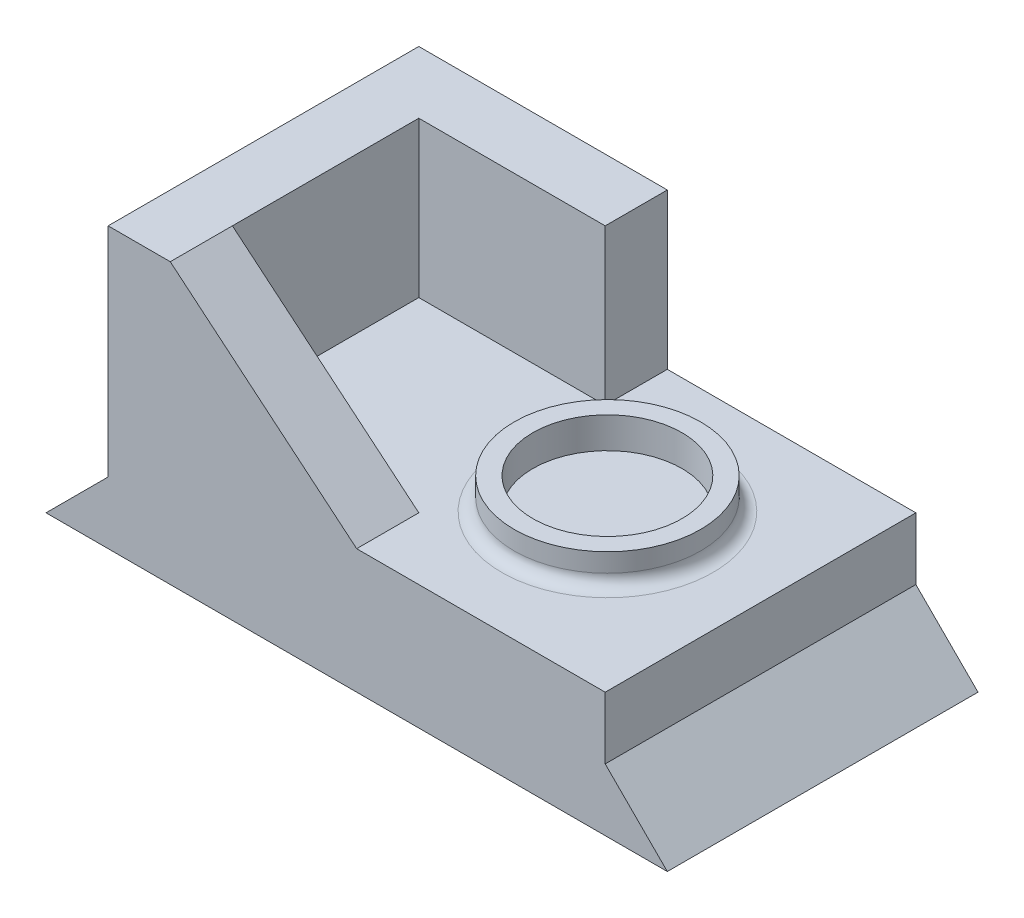
ISO-10303-21;
HEADER;
FILE_DESCRIPTION(('STEP AP214'),'2;1');
FILE_NAME('part.step','',(''),(''),'','','');
FILE_SCHEMA(('AUTOMOTIVE_DESIGN { 1 0 10303 214 1 1 1 1 }'));
ENDSEC;
DATA;
#1=APPLICATION_CONTEXT('core data for automotive mechanical design processes');
#2=APPLICATION_PROTOCOL_DEFINITION('international standard','automotive_design',2000,#1);
#3=PRODUCT_CONTEXT('',#1,'mechanical');
#4=PRODUCT('Part','Part','',(#3));
#5=PRODUCT_RELATED_PRODUCT_CATEGORY('part','',(#4));
#6=PRODUCT_DEFINITION_FORMATION('','',#4);
#7=PRODUCT_DEFINITION_CONTEXT('part definition',#1,'design');
#8=PRODUCT_DEFINITION('design','',#6,#7);
#9=PRODUCT_DEFINITION_SHAPE('','',#8);
#10=(LENGTH_UNIT() NAMED_UNIT(*) SI_UNIT(.MILLI.,.METRE.));
#11=(NAMED_UNIT(*) PLANE_ANGLE_UNIT() SI_UNIT($,.RADIAN.));
#12=(NAMED_UNIT(*) SI_UNIT($,.STERADIAN.) SOLID_ANGLE_UNIT());
#13=UNCERTAINTY_MEASURE_WITH_UNIT(LENGTH_MEASURE(1.E-05),#10,'distance_accuracy_value','');
#14=(GEOMETRIC_REPRESENTATION_CONTEXT(3) GLOBAL_UNCERTAINTY_ASSIGNED_CONTEXT((#13)) GLOBAL_UNIT_ASSIGNED_CONTEXT((#10,
#11,#12)) REPRESENTATION_CONTEXT('',''));
#15=CARTESIAN_POINT('',(0.,0.,0.));
#16=DIRECTION('',(0.,0.,1.));
#17=DIRECTION('',(1.,0.,0.));
#18=AXIS2_PLACEMENT_3D('',#15,#16,#17);
#19=CARTESIAN_POINT('',(50.,45.,-50.));
#20=DIRECTION('',(0.,1.,0.));
#21=DIRECTION('',(-1.,0.,0.));
#22=AXIS2_PLACEMENT_3D('',#19,#20,#21);
#23=PLANE('',#22);
#24=DIRECTION('',(-1.,0.,0.));
#25=VECTOR('',#24,1.);
#26=CARTESIAN_POINT('',(50.,45.,0.));
#27=LINE('',#26,#25);
#28=CARTESIAN_POINT('',(20.,45.,0.));
#29=VERTEX_POINT('',#28);
#30=CARTESIAN_POINT('',(10.,45.,0.));
#31=VERTEX_POINT('',#30);
#32=EDGE_CURVE('E139',#29,#31,#27,.T.);
#33=ORIENTED_EDGE('',*,*,#32,.F.);
#34=DIRECTION('',(0.,0.,1.));
#35=VECTOR('',#34,1.);
#36=CARTESIAN_POINT('',(20.,45.,-10.));
#37=LINE('',#36,#35);
#38=CARTESIAN_POINT('',(20.,45.,-10.));
#39=VERTEX_POINT('',#38);
#40=EDGE_CURVE('E125',#39,#29,#37,.T.);
#41=ORIENTED_EDGE('',*,*,#40,.F.);
#42=DIRECTION('',(0.,0.,1.));
#43=VECTOR('',#42,1.);
#44=CARTESIAN_POINT('',(20.,45.,-40.));
#45=LINE('',#44,#43);
#46=CARTESIAN_POINT('',(20.,45.,-40.));
#47=VERTEX_POINT('',#46);
#48=EDGE_CURVE('E137',#47,#39,#45,.T.);
#49=ORIENTED_EDGE('',*,*,#48,.F.);
#50=DIRECTION('',(1.,0.,0.));
#51=VECTOR('',#50,1.);
#52=CARTESIAN_POINT('',(20.,45.,-40.));
#53=LINE('',#52,#51);
#54=CARTESIAN_POINT('',(50.,45.,-40.));
#55=VERTEX_POINT('',#54);
#56=EDGE_CURVE('E161',#47,#55,#53,.T.);
#57=ORIENTED_EDGE('',*,*,#56,.T.);
#58=DIRECTION('',(0.,0.,1.));
#59=VECTOR('',#58,1.);
#60=CARTESIAN_POINT('',(50.,45.,-50.));
#61=LINE('',#60,#59);
#62=CARTESIAN_POINT('',(50.,45.,-50.));
#63=VERTEX_POINT('',#62);
#64=EDGE_CURVE('E214',#63,#55,#61,.T.);
#65=ORIENTED_EDGE('',*,*,#64,.F.);
#66=DIRECTION('',(-1.,0.,0.));
#67=VECTOR('',#66,1.);
#68=CARTESIAN_POINT('',(50.,45.,-50.));
#69=LINE('',#68,#67);
#70=CARTESIAN_POINT('',(10.,45.,-50.));
#71=VERTEX_POINT('',#70);
#72=EDGE_CURVE('E204',#63,#71,#69,.T.);
#73=ORIENTED_EDGE('',*,*,#72,.T.);
#74=DIRECTION('',(0.,0.,1.));
#75=VECTOR('',#74,1.);
#76=CARTESIAN_POINT('',(10.,45.,-50.));
#77=LINE('',#76,#75);
#78=EDGE_CURVE('E192',#71,#31,#77,.T.);
#79=ORIENTED_EDGE('',*,*,#78,.T.);
#80=EDGE_LOOP('',(#33,#41,#49,#57,#65,#73,#79));
#81=FACE_BOUND('',#80,.T.);
#82=ADVANCED_FACE('F38',(#81),#23,.T.);
#83=CARTESIAN_POINT('',(0.,0.,0.));
#84=DIRECTION('',(0.,0.,1.));
#85=DIRECTION('',(1.,0.,0.));
#86=AXIS2_PLACEMENT_3D('',#83,#84,#85);
#87=PLANE('',#86);
#88=DIRECTION('',(-1.,0.,0.));
#89=VECTOR('',#88,1.);
#90=CARTESIAN_POINT('',(100.,20.,0.));
#91=LINE('',#90,#89);
#92=CARTESIAN_POINT('',(90.,20.,0.));
#93=VERTEX_POINT('',#92);
#94=CARTESIAN_POINT('',(50.,20.,0.));
#95=VERTEX_POINT('',#94);
#96=EDGE_CURVE('E210',#93,#95,#91,.T.);
#97=ORIENTED_EDGE('',*,*,#96,.T.);
#98=DIRECTION('',(-0.768221279597376,0.64018439966448,0.));
#99=VECTOR('',#98,1.);
#100=CARTESIAN_POINT('',(50.,20.,0.));
#101=LINE('',#100,#99);
#102=EDGE_CURVE('E130',#95,#29,#101,.T.);
#103=ORIENTED_EDGE('',*,*,#102,.T.);
#104=ORIENTED_EDGE('',*,*,#32,.T.);
#105=DIRECTION('',(0.,1.,0.));
#106=VECTOR('',#105,1.);
#107=CARTESIAN_POINT('',(10.,45.,0.));
#108=LINE('',#107,#106);
#109=CARTESIAN_POINT('',(10.,10.,0.));
#110=VERTEX_POINT('',#109);
#111=EDGE_CURVE('E184',#110,#31,#108,.T.);
#112=ORIENTED_EDGE('',*,*,#111,.F.);
#113=DIRECTION('',(0.707106781186548,0.707106781186548,0.));
#114=VECTOR('',#113,1.);
#115=CARTESIAN_POINT('',(10.,10.,0.));
#116=LINE('',#115,#114);
#117=CARTESIAN_POINT('',(0.,0.,0.));
#118=VERTEX_POINT('',#117);
#119=EDGE_CURVE('E178',#118,#110,#116,.T.);
#120=ORIENTED_EDGE('',*,*,#119,.F.);
#121=DIRECTION('',(1.,0.,0.));
#122=VECTOR('',#121,1.);
#123=CARTESIAN_POINT('',(0.,0.,0.));
#124=LINE('',#123,#122);
#125=CARTESIAN_POINT('',(100.,0.,0.));
#126=VERTEX_POINT('',#125);
#127=EDGE_CURVE('E194',#118,#126,#124,.T.);
#128=ORIENTED_EDGE('',*,*,#127,.T.);
#129=DIRECTION('',(0.707106781186547,-0.707106781186548,0.));
#130=VECTOR('',#129,1.);
#131=CARTESIAN_POINT('',(90.,10.,0.));
#132=LINE('',#131,#130);
#133=CARTESIAN_POINT('',(90.,10.,0.));
#134=VERTEX_POINT('',#133);
#135=EDGE_CURVE('E171',#134,#126,#132,.T.);
#136=ORIENTED_EDGE('',*,*,#135,.F.);
#137=DIRECTION('',(0.,-1.,0.));
#138=VECTOR('',#137,1.);
#139=CARTESIAN_POINT('',(90.,20.,0.));
#140=LINE('',#139,#138);
#141=EDGE_CURVE('E163',#93,#134,#140,.T.);
#142=ORIENTED_EDGE('',*,*,#141,.F.);
#143=EDGE_LOOP('',(#97,#103,#104,#112,#120,#128,#136,#142));
#144=FACE_BOUND('',#143,.T.);
#145=ADVANCED_FACE('F244',(#144),#87,.T.);
#146=CARTESIAN_POINT('',(20.,45.,-10.));
#147=DIRECTION('',(0.,0.,1.));
#148=DIRECTION('',(0.,-1.,0.));
#149=AXIS2_PLACEMENT_3D('',#146,#147,#148);
#150=PLANE('',#149);
#151=DIRECTION('',(-0.768221279597376,0.64018439966448,0.));
#152=VECTOR('',#151,1.);
#153=CARTESIAN_POINT('',(50.,20.,-10.));
#154=LINE('',#153,#152);
#155=CARTESIAN_POINT('',(50.,20.,-10.));
#156=VERTEX_POINT('',#155);
#157=EDGE_CURVE('E122',#156,#39,#154,.T.);
#158=ORIENTED_EDGE('',*,*,#157,.F.);
#159=DIRECTION('',(1.,0.,0.));
#160=VECTOR('',#159,1.);
#161=CARTESIAN_POINT('',(20.,20.,-10.));
#162=LINE('',#161,#160);
#163=CARTESIAN_POINT('',(20.,20.,-10.));
#164=VERTEX_POINT('',#163);
#165=EDGE_CURVE('E145',#164,#156,#162,.T.);
#166=ORIENTED_EDGE('',*,*,#165,.F.);
#167=DIRECTION('',(0.,-1.,0.));
#168=VECTOR('',#167,1.);
#169=CARTESIAN_POINT('',(20.,45.,-10.));
#170=LINE('',#169,#168);
#171=EDGE_CURVE('E143',#39,#164,#170,.T.);
#172=ORIENTED_EDGE('',*,*,#171,.F.);
#173=EDGE_LOOP('',(#158,#166,#172));
#174=FACE_BOUND('',#173,.T.);
#175=ADVANCED_FACE('F144',(#174),#150,.F.);
#176=CARTESIAN_POINT('',(50.,20.,-50.));
#177=DIRECTION('',(1.,0.,0.));
#178=DIRECTION('',(0.,0.,-1.));
#179=AXIS2_PLACEMENT_3D('',#176,#177,#178);
#180=PLANE('',#179);
#181=DIRECTION('',(0.,1.,0.));
#182=VECTOR('',#181,1.);
#183=CARTESIAN_POINT('',(50.,20.,-40.));
#184=LINE('',#183,#182);
#185=CARTESIAN_POINT('',(50.,20.,-40.));
#186=VERTEX_POINT('',#185);
#187=EDGE_CURVE('E140',#186,#55,#184,.T.);
#188=ORIENTED_EDGE('',*,*,#187,.F.);
#189=DIRECTION('',(0.,0.,1.));
#190=VECTOR('',#189,1.);
#191=CARTESIAN_POINT('',(50.,20.,-50.));
#192=LINE('',#191,#190);
#193=CARTESIAN_POINT('',(50.,20.,-50.));
#194=VERTEX_POINT('',#193);
#195=EDGE_CURVE('E218',#194,#186,#192,.T.);
#196=ORIENTED_EDGE('',*,*,#195,.F.);
#197=DIRECTION('',(0.,1.,0.));
#198=VECTOR('',#197,1.);
#199=CARTESIAN_POINT('',(50.,20.,-50.));
#200=LINE('',#199,#198);
#201=EDGE_CURVE('E201',#194,#63,#200,.T.);
#202=ORIENTED_EDGE('',*,*,#201,.T.);
#203=ORIENTED_EDGE('',*,*,#64,.T.);
#204=EDGE_LOOP('',(#188,#196,#202,#203));
#205=FACE_BOUND('',#204,.T.);
#206=ADVANCED_FACE('F253',(#205),#180,.T.);
#207=CARTESIAN_POINT('',(100.,20.,-50.));
#208=DIRECTION('',(0.,1.,0.));
#209=DIRECTION('',(-1.,0.,0.));
#210=AXIS2_PLACEMENT_3D('',#207,#208,#209);
#211=PLANE('',#210);
#212=CARTESIAN_POINT('',(65.,20.,-25.3570674190145));
#213=DIRECTION('',(0.,1.,0.));
#214=DIRECTION('',(-1.,0.,0.));
#215=AXIS2_PLACEMENT_3D('',#212,#213,#214);
#216=CIRCLE('',#215,17.);
#217=CARTESIAN_POINT('',(48.,20.,-25.3570674190145));
#218=VERTEX_POINT('',#217);
#219=EDGE_CURVE('E11',#218,#218,#216,.F.);
#220=ORIENTED_EDGE('',*,*,#219,.T.);
#221=EDGE_LOOP('',(#220));
#222=FACE_BOUND('',#221,.T.);
#223=DIRECTION('',(0.,0.,1.));
#224=VECTOR('',#223,1.);
#225=CARTESIAN_POINT('',(90.,20.,-50.));
#226=LINE('',#225,#224);
#227=CARTESIAN_POINT('',(90.,20.,-50.));
#228=VERTEX_POINT('',#227);
#229=EDGE_CURVE('E61',#228,#93,#226,.T.);
#230=ORIENTED_EDGE('',*,*,#229,.F.);
#231=DIRECTION('',(-1.,0.,0.));
#232=VECTOR('',#231,1.);
#233=CARTESIAN_POINT('',(100.,20.,-50.));
#234=LINE('',#233,#232);
#235=EDGE_CURVE('E199',#228,#194,#234,.T.);
#236=ORIENTED_EDGE('',*,*,#235,.T.);
#237=ORIENTED_EDGE('',*,*,#195,.T.);
#238=DIRECTION('',(1.,0.,0.));
#239=VECTOR('',#238,1.);
#240=CARTESIAN_POINT('',(20.,20.,-40.));
#241=LINE('',#240,#239);
#242=CARTESIAN_POINT('',(20.,20.,-40.));
#243=VERTEX_POINT('',#242);
#244=EDGE_CURVE('E164',#243,#186,#241,.T.);
#245=ORIENTED_EDGE('',*,*,#244,.F.);
#246=DIRECTION('',(0.,0.,-1.));
#247=VECTOR('',#246,1.);
#248=CARTESIAN_POINT('',(20.,20.,-10.));
#249=LINE('',#248,#247);
#250=EDGE_CURVE('E149',#164,#243,#249,.T.);
#251=ORIENTED_EDGE('',*,*,#250,.F.);
#252=ORIENTED_EDGE('',*,*,#165,.T.);
#253=EDGE_CURVE('E53',#156,#95,#192,.T.);
#254=ORIENTED_EDGE('',*,*,#253,.T.);
#255=ORIENTED_EDGE('',*,*,#96,.F.);
#256=EDGE_LOOP('',(#230,#236,#237,#245,#251,#252,#254,#255));
#257=FACE_BOUND('',#256,.T.);
#258=ADVANCED_FACE('F241',(#222,#257),#211,.T.);
#259=CARTESIAN_POINT('',(0.,0.,-50.));
#260=DIRECTION('',(0.,-1.,0.));
#261=DIRECTION('',(0.,0.,-1.));
#262=AXIS2_PLACEMENT_3D('',#259,#260,#261);
#263=PLANE('',#262);
#264=ORIENTED_EDGE('',*,*,#127,.F.);
#265=DIRECTION('',(0.,0.,1.));
#266=VECTOR('',#265,1.);
#267=CARTESIAN_POINT('',(0.,0.,-50.));
#268=LINE('',#267,#266);
#269=CARTESIAN_POINT('',(0.,0.,-50.));
#270=VERTEX_POINT('',#269);
#271=EDGE_CURVE('E207',#270,#118,#268,.T.);
#272=ORIENTED_EDGE('',*,*,#271,.F.);
#273=DIRECTION('',(1.,0.,0.));
#274=VECTOR('',#273,1.);
#275=CARTESIAN_POINT('',(0.,0.,-50.));
#276=LINE('',#275,#274);
#277=CARTESIAN_POINT('',(100.,0.,-50.));
#278=VERTEX_POINT('',#277);
#279=EDGE_CURVE('E196',#270,#278,#276,.T.);
#280=ORIENTED_EDGE('',*,*,#279,.T.);
#281=DIRECTION('',(0.,0.,1.));
#282=VECTOR('',#281,1.);
#283=CARTESIAN_POINT('',(100.,0.,-50.));
#284=LINE('',#283,#282);
#285=EDGE_CURVE('E221',#278,#126,#284,.T.);
#286=ORIENTED_EDGE('',*,*,#285,.T.);
#287=EDGE_LOOP('',(#264,#272,#280,#286));
#288=FACE_BOUND('',#287,.T.);
#289=ADVANCED_FACE('F257',(#288),#263,.T.);
#290=CARTESIAN_POINT('',(0.,0.,-50.));
#291=DIRECTION('',(0.,0.,1.));
#292=DIRECTION('',(1.,0.,0.));
#293=AXIS2_PLACEMENT_3D('',#290,#291,#292);
#294=PLANE('',#293);
#295=DIRECTION('',(0.,-1.,0.));
#296=VECTOR('',#295,1.);
#297=CARTESIAN_POINT('',(90.,20.,-50.));
#298=LINE('',#297,#296);
#299=CARTESIAN_POINT('',(90.,10.,-50.));
#300=VERTEX_POINT('',#299);
#301=EDGE_CURVE('E167',#228,#300,#298,.T.);
#302=ORIENTED_EDGE('',*,*,#301,.T.);
#303=DIRECTION('',(0.707106781186547,-0.707106781186548,0.));
#304=VECTOR('',#303,1.);
#305=CARTESIAN_POINT('',(90.,10.,-50.));
#306=LINE('',#305,#304);
#307=EDGE_CURVE('E170',#300,#278,#306,.T.);
#308=ORIENTED_EDGE('',*,*,#307,.T.);
#309=ORIENTED_EDGE('',*,*,#279,.F.);
#310=DIRECTION('',(0.707106781186548,0.707106781186548,0.));
#311=VECTOR('',#310,1.);
#312=CARTESIAN_POINT('',(10.,10.,-50.));
#313=LINE('',#312,#311);
#314=CARTESIAN_POINT('',(10.,10.,-50.));
#315=VERTEX_POINT('',#314);
#316=EDGE_CURVE('E180',#270,#315,#313,.T.);
#317=ORIENTED_EDGE('',*,*,#316,.T.);
#318=DIRECTION('',(0.,1.,0.));
#319=VECTOR('',#318,1.);
#320=CARTESIAN_POINT('',(10.,45.,-50.));
#321=LINE('',#320,#319);
#322=EDGE_CURVE('E183',#315,#71,#321,.T.);
#323=ORIENTED_EDGE('',*,*,#322,.T.);
#324=ORIENTED_EDGE('',*,*,#72,.F.);
#325=ORIENTED_EDGE('',*,*,#201,.F.);
#326=ORIENTED_EDGE('',*,*,#235,.F.);
#327=EDGE_LOOP('',(#302,#308,#309,#317,#323,#324,#325,#326));
#328=FACE_BOUND('',#327,.T.);
#329=ADVANCED_FACE('F260',(#328),#294,.F.);
#330=CARTESIAN_POINT('',(10.,45.,-50.));
#331=DIRECTION('',(1.,0.,0.));
#332=DIRECTION('',(0.,1.,0.));
#333=AXIS2_PLACEMENT_3D('',#330,#331,#332);
#334=PLANE('',#333);
#335=ORIENTED_EDGE('',*,*,#111,.T.);
#336=ORIENTED_EDGE('',*,*,#78,.F.);
#337=ORIENTED_EDGE('',*,*,#322,.F.);
#338=DIRECTION('',(0.,0.,1.));
#339=VECTOR('',#338,1.);
#340=CARTESIAN_POINT('',(10.,10.,-50.));
#341=LINE('',#340,#339);
#342=EDGE_CURVE('E187',#315,#110,#341,.T.);
#343=ORIENTED_EDGE('',*,*,#342,.T.);
#344=EDGE_LOOP('',(#335,#336,#337,#343));
#345=FACE_BOUND('',#344,.T.);
#346=ADVANCED_FACE('F265',(#345),#334,.F.);
#347=CARTESIAN_POINT('',(10.,10.,-50.));
#348=DIRECTION('',(0.707106781186548,-0.707106781186548,0.));
#349=DIRECTION('',(0.707106781186548,0.707106781186548,0.));
#350=AXIS2_PLACEMENT_3D('',#347,#348,#349);
#351=PLANE('',#350);
#352=ORIENTED_EDGE('',*,*,#119,.T.);
#353=ORIENTED_EDGE('',*,*,#342,.F.);
#354=ORIENTED_EDGE('',*,*,#316,.F.);
#355=ORIENTED_EDGE('',*,*,#271,.T.);
#356=EDGE_LOOP('',(#352,#353,#354,#355));
#357=FACE_BOUND('',#356,.T.);
#358=ADVANCED_FACE('F274',(#357),#351,.F.);
#359=CARTESIAN_POINT('',(90.,10.,-50.));
#360=DIRECTION('',(-0.707106781186548,-0.707106781186547,0.));
#361=DIRECTION('',(0.707106781186547,-0.707106781186548,0.));
#362=AXIS2_PLACEMENT_3D('',#359,#360,#361);
#363=PLANE('',#362);
#364=ORIENTED_EDGE('',*,*,#135,.T.);
#365=ORIENTED_EDGE('',*,*,#285,.F.);
#366=ORIENTED_EDGE('',*,*,#307,.F.);
#367=DIRECTION('',(0.,0.,1.));
#368=VECTOR('',#367,1.);
#369=CARTESIAN_POINT('',(90.,10.,-50.));
#370=LINE('',#369,#368);
#371=EDGE_CURVE('E176',#300,#134,#370,.T.);
#372=ORIENTED_EDGE('',*,*,#371,.T.);
#373=EDGE_LOOP('',(#364,#365,#366,#372));
#374=FACE_BOUND('',#373,.T.);
#375=ADVANCED_FACE('F280',(#374),#363,.F.);
#376=CARTESIAN_POINT('',(90.,20.,-50.));
#377=DIRECTION('',(-1.,0.,0.));
#378=DIRECTION('',(0.,0.,1.));
#379=AXIS2_PLACEMENT_3D('',#376,#377,#378);
#380=PLANE('',#379);
#381=ORIENTED_EDGE('',*,*,#141,.T.);
#382=ORIENTED_EDGE('',*,*,#371,.F.);
#383=ORIENTED_EDGE('',*,*,#301,.F.);
#384=ORIENTED_EDGE('',*,*,#229,.T.);
#385=EDGE_LOOP('',(#381,#382,#383,#384));
#386=FACE_BOUND('',#385,.T.);
#387=ADVANCED_FACE('F281',(#386),#380,.F.);
#388=CARTESIAN_POINT('',(20.,20.,-40.));
#389=DIRECTION('',(0.,0.,-1.));
#390=DIRECTION('',(-1.,0.,0.));
#391=AXIS2_PLACEMENT_3D('',#388,#389,#390);
#392=PLANE('',#391);
#393=ORIENTED_EDGE('',*,*,#187,.T.);
#394=ORIENTED_EDGE('',*,*,#56,.F.);
#395=DIRECTION('',(0.,1.,0.));
#396=VECTOR('',#395,1.);
#397=CARTESIAN_POINT('',(20.,20.,-40.));
#398=LINE('',#397,#396);
#399=EDGE_CURVE('E154',#243,#47,#398,.T.);
#400=ORIENTED_EDGE('',*,*,#399,.F.);
#401=ORIENTED_EDGE('',*,*,#244,.T.);
#402=EDGE_LOOP('',(#393,#394,#400,#401));
#403=FACE_BOUND('',#402,.T.);
#404=ADVANCED_FACE('F285',(#403),#392,.F.);
#405=CARTESIAN_POINT('',(20.,0.,0.));
#406=DIRECTION('',(1.,0.,0.));
#407=DIRECTION('',(0.,0.,-1.));
#408=AXIS2_PLACEMENT_3D('',#405,#406,#407);
#409=PLANE('',#408);
#410=ORIENTED_EDGE('',*,*,#48,.T.);
#411=ORIENTED_EDGE('',*,*,#171,.T.);
#412=ORIENTED_EDGE('',*,*,#250,.T.);
#413=ORIENTED_EDGE('',*,*,#399,.T.);
#414=EDGE_LOOP('',(#410,#411,#412,#413));
#415=FACE_BOUND('',#414,.T.);
#416=ADVANCED_FACE('F152',(#415),#409,.T.);
#417=CARTESIAN_POINT('',(50.,20.,-10.));
#418=DIRECTION('',(0.64018439966448,0.768221279597376,0.));
#419=DIRECTION('',(-0.768221279597376,0.64018439966448,0.));
#420=AXIS2_PLACEMENT_3D('',#417,#418,#419);
#421=PLANE('',#420);
#422=ORIENTED_EDGE('',*,*,#102,.F.);
#423=ORIENTED_EDGE('',*,*,#253,.F.);
#424=ORIENTED_EDGE('',*,*,#157,.T.);
#425=ORIENTED_EDGE('',*,*,#40,.T.);
#426=EDGE_LOOP('',(#422,#423,#424,#425));
#427=FACE_BOUND('',#426,.T.);
#428=ADVANCED_FACE('F124',(#427),#421,.T.);
#429=CARTESIAN_POINT('',(65.,25.,-25.3570674190145));
#430=DIRECTION('',(0.,1.,0.));
#431=DIRECTION('',(-1.,0.,0.));
#432=AXIS2_PLACEMENT_3D('',#429,#430,#431);
#433=PLANE('',#432);
#434=CARTESIAN_POINT('',(65.,25.,-25.3570674190145));
#435=DIRECTION('',(0.,1.,0.));
#436=DIRECTION('',(-1.,0.,0.));
#437=AXIS2_PLACEMENT_3D('',#434,#435,#436);
#438=CIRCLE('',#437,15.);
#439=CARTESIAN_POINT('',(50.,25.,-25.3570674190145));
#440=VERTEX_POINT('',#439);
#441=EDGE_CURVE('E325',#440,#440,#438,.T.);
#442=ORIENTED_EDGE('',*,*,#441,.T.);
#443=EDGE_LOOP('',(#442));
#444=FACE_BOUND('',#443,.T.);
#445=CARTESIAN_POINT('',(65.,25.,-25.3570674190145));
#446=DIRECTION('',(0.,1.,0.));
#447=DIRECTION('',(-1.,0.,0.));
#448=AXIS2_PLACEMENT_3D('',#445,#446,#447);
#449=CIRCLE('',#448,12.);
#450=CARTESIAN_POINT('',(53.,25.,-25.3570674190145));
#451=VERTEX_POINT('',#450);
#452=EDGE_CURVE('E322',#451,#451,#449,.T.);
#453=ORIENTED_EDGE('',*,*,#452,.F.);
#454=EDGE_LOOP('',(#453));
#455=FACE_BOUND('',#454,.T.);
#456=ADVANCED_FACE('F309',(#444,#455),#433,.T.);
#457=CARTESIAN_POINT('',(65.,25.,-25.3570674190145));
#458=DIRECTION('',(0.,-1.,0.));
#459=DIRECTION('',(1.,0.,0.));
#460=AXIS2_PLACEMENT_3D('',#457,#458,#459);
#461=CYLINDRICAL_SURFACE('',#460,15.);
#462=CARTESIAN_POINT('',(65.,22.,-25.3570674190145));
#463=DIRECTION('',(0.,1.,0.));
#464=DIRECTION('',(-1.,0.,0.));
#465=AXIS2_PLACEMENT_3D('',#462,#463,#464);
#466=CIRCLE('',#465,15.);
#467=CARTESIAN_POINT('',(50.,22.,-25.3570674190145));
#468=VERTEX_POINT('',#467);
#469=EDGE_CURVE('E46',#468,#468,#466,.T.);
#470=ORIENTED_EDGE('',*,*,#469,.T.);
#471=EDGE_LOOP('',(#470));
#472=FACE_BOUND('',#471,.T.);
#473=ORIENTED_EDGE('',*,*,#441,.F.);
#474=EDGE_LOOP('',(#473));
#475=FACE_BOUND('',#474,.T.);
#476=ADVANCED_FACE('F229',(#472,#475),#461,.T.);
#477=CARTESIAN_POINT('',(65.,25.,-25.3570674190145));
#478=DIRECTION('',(0.,-1.,0.));
#479=DIRECTION('',(1.,0.,0.));
#480=AXIS2_PLACEMENT_3D('',#477,#478,#479);
#481=CYLINDRICAL_SURFACE('',#480,12.);
#482=ORIENTED_EDGE('',*,*,#452,.T.);
#483=EDGE_LOOP('',(#482));
#484=FACE_BOUND('',#483,.T.);
#485=CARTESIAN_POINT('',(65.,20.,-25.3570674190145));
#486=DIRECTION('',(0.,1.,0.));
#487=DIRECTION('',(-1.,0.,0.));
#488=AXIS2_PLACEMENT_3D('',#485,#486,#487);
#489=CIRCLE('',#488,12.);
#490=CARTESIAN_POINT('',(53.,20.,-25.3570674190145));
#491=VERTEX_POINT('',#490);
#492=EDGE_CURVE('E217',#491,#491,#489,.F.);
#493=ORIENTED_EDGE('',*,*,#492,.T.);
#494=EDGE_LOOP('',(#493));
#495=FACE_BOUND('',#494,.T.);
#496=ADVANCED_FACE('F238',(#484,#495),#481,.F.);
#497=ORIENTED_EDGE('',*,*,#492,.F.);
#498=EDGE_LOOP('',(#497));
#499=FACE_BOUND('',#498,.T.);
#500=ADVANCED_FACE('F233',(#499),#211,.T.);
#501=CARTESIAN_POINT('',(65.,22.,-25.3570674190145));
#502=DIRECTION('',(0.,1.,0.));
#503=DIRECTION('',(-1.,0.,0.));
#504=AXIS2_PLACEMENT_3D('',#501,#502,#503);
#505=TOROIDAL_SURFACE('',#504,17.,2.);
#506=ORIENTED_EDGE('',*,*,#219,.F.);
#507=EDGE_LOOP('',(#506));
#508=FACE_BOUND('',#507,.T.);
#509=ORIENTED_EDGE('',*,*,#469,.F.);
#510=EDGE_LOOP('',(#509));
#511=FACE_BOUND('',#510,.T.);
#512=ADVANCED_FACE('F40',(#508,#511),#505,.F.);
#513=CLOSED_SHELL('',(#82,#145,#175,#206,#258,#289,#329,#346,#358,#375,#387,#404,#416,#428,#456,
#476,#496,#500,#512));
#514=MANIFOLD_SOLID_BREP('B2',#513);
#515=ADVANCED_BREP_SHAPE_REPRESENTATION('',(#18,#514),#14);
#516=SHAPE_DEFINITION_REPRESENTATION(#9,#515);
ENDSEC;
END-ISO-10303-21;
